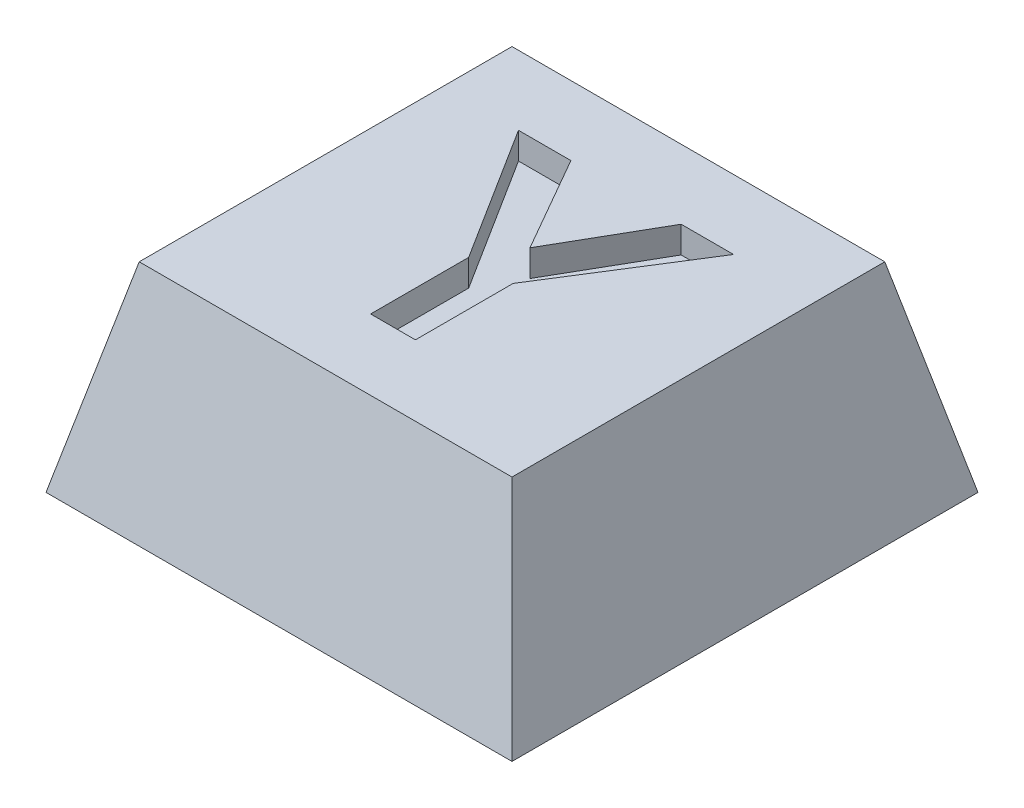
ISO-10303-21;
HEADER;
FILE_DESCRIPTION(('STEP AP214'),'2;1');
FILE_NAME('part.step','',(''),(''),'','','');
FILE_SCHEMA(('AUTOMOTIVE_DESIGN { 1 0 10303 214 1 1 1 1 }'));
ENDSEC;
DATA;
#1=APPLICATION_CONTEXT('core data for automotive mechanical design processes');
#2=APPLICATION_PROTOCOL_DEFINITION('international standard','automotive_design',2000,#1);
#3=PRODUCT_CONTEXT('',#1,'mechanical');
#4=PRODUCT('Part','Part','',(#3));
#5=PRODUCT_RELATED_PRODUCT_CATEGORY('part','',(#4));
#6=PRODUCT_DEFINITION_FORMATION('','',#4);
#7=PRODUCT_DEFINITION_CONTEXT('part definition',#1,'design');
#8=PRODUCT_DEFINITION('design','',#6,#7);
#9=PRODUCT_DEFINITION_SHAPE('','',#8);
#10=(LENGTH_UNIT() NAMED_UNIT(*) SI_UNIT(.MILLI.,.METRE.));
#11=(NAMED_UNIT(*) PLANE_ANGLE_UNIT() SI_UNIT($,.RADIAN.));
#12=(NAMED_UNIT(*) SI_UNIT($,.STERADIAN.) SOLID_ANGLE_UNIT());
#13=UNCERTAINTY_MEASURE_WITH_UNIT(LENGTH_MEASURE(1.E-05),#10,'distance_accuracy_value','');
#14=(GEOMETRIC_REPRESENTATION_CONTEXT(3) GLOBAL_UNCERTAINTY_ASSIGNED_CONTEXT((#13)) GLOBAL_UNIT_ASSIGNED_CONTEXT((#10,
#11,#12)) REPRESENTATION_CONTEXT('',''));
#15=CARTESIAN_POINT('',(0.,0.,0.));
#16=DIRECTION('',(0.,0.,1.));
#17=DIRECTION('',(1.,0.,0.));
#18=AXIS2_PLACEMENT_3D('',#15,#16,#17);
#19=CARTESIAN_POINT('',(0.,3.,0.));
#20=DIRECTION('',(0.,-1.,0.));
#21=DIRECTION('',(0.,0.,-1.));
#22=AXIS2_PLACEMENT_3D('',#19,#20,#21);
#23=PLANE('',#22);
#24=DIRECTION('',(-1.,0.,0.));
#25=VECTOR('',#24,1.);
#26=CARTESIAN_POINT('',(11.,3.,-0.7));
#27=LINE('',#26,#25);
#28=CARTESIAN_POINT('',(6.3,3.,-0.7));
#29=VERTEX_POINT('',#28);
#30=CARTESIAN_POINT('',(0.7,3.,-0.7));
#31=VERTEX_POINT('',#30);
#32=EDGE_CURVE('E66',#29,#31,#27,.T.);
#33=ORIENTED_EDGE('',*,*,#32,.F.);
#34=DIRECTION('',(0.,0.,1.));
#35=VECTOR('',#34,1.);
#36=CARTESIAN_POINT('',(6.3,3.,-7.));
#37=LINE('',#36,#35);
#38=CARTESIAN_POINT('',(6.3,3.,-6.3));
#39=VERTEX_POINT('',#38);
#40=EDGE_CURVE('E189',#39,#29,#37,.T.);
#41=ORIENTED_EDGE('',*,*,#40,.F.);
#42=DIRECTION('',(-1.,0.,0.));
#43=VECTOR('',#42,1.);
#44=CARTESIAN_POINT('',(11.,3.,-6.3));
#45=LINE('',#44,#43);
#46=CARTESIAN_POINT('',(0.699999999999998,3.,-6.3));
#47=VERTEX_POINT('',#46);
#48=EDGE_CURVE('E176',#39,#47,#45,.T.);
#49=ORIENTED_EDGE('',*,*,#48,.T.);
#50=DIRECTION('',(0.,0.,1.));
#51=VECTOR('',#50,1.);
#52=CARTESIAN_POINT('',(0.7,3.,-7.));
#53=LINE('',#52,#51);
#54=EDGE_CURVE('E190',#47,#31,#53,.T.);
#55=ORIENTED_EDGE('',*,*,#54,.T.);
#56=EDGE_LOOP('',(#33,#41,#49,#55));
#57=FACE_BOUND('',#56,.T.);
#58=DIRECTION('',(-1.,0.,0.));
#59=VECTOR('',#58,1.);
#60=CARTESIAN_POINT('',(3.7899740454906,3.,-1.75928235155919));
#61=LINE('',#60,#59);
#62=CARTESIAN_POINT('',(3.7899740454906,3.,-1.75928235155919));
#63=VERTEX_POINT('',#62);
#64=CARTESIAN_POINT('',(3.11689712241367,3.,-1.75928235155919));
#65=VERTEX_POINT('',#64);
#66=EDGE_CURVE('E59',#63,#65,#61,.T.);
#67=ORIENTED_EDGE('',*,*,#66,.T.);
#68=DIRECTION('',(0.,0.,-1.));
#69=VECTOR('',#68,1.);
#70=CARTESIAN_POINT('',(3.11689712241367,3.,-1.75928235155919));
#71=LINE('',#70,#69);
#72=CARTESIAN_POINT('',(3.11689712241367,3.,-3.23233924258483));
#73=VERTEX_POINT('',#72);
#74=EDGE_CURVE('E160',#65,#73,#71,.T.);
#75=ORIENTED_EDGE('',*,*,#74,.T.);
#76=DIRECTION('',(-0.533596697576265,0.,-0.845739063976416));
#77=VECTOR('',#76,1.);
#78=CARTESIAN_POINT('',(3.11689712241367,3.,-3.23233924258483));
#79=LINE('',#78,#77);
#80=CARTESIAN_POINT('',(1.83805096856752,3.,-5.25928235155919));
#81=VERTEX_POINT('',#80);
#82=EDGE_CURVE('E470',#73,#81,#79,.T.);
#83=ORIENTED_EDGE('',*,*,#82,.T.);
#84=DIRECTION('',(1.,0.,0.));
#85=VECTOR('',#84,1.);
#86=CARTESIAN_POINT('',(1.83805096856752,3.,-5.25928235155919));
#87=LINE('',#86,#85);
#88=CARTESIAN_POINT('',(2.62541074420854,3.,-5.25928235155919));
#89=VERTEX_POINT('',#88);
#90=EDGE_CURVE('E472',#81,#89,#87,.T.);
#91=ORIENTED_EDGE('',*,*,#90,.T.);
#92=DIRECTION('',(0.497591443991854,0.,0.867411525670545));
#93=VECTOR('',#92,1.);
#94=CARTESIAN_POINT('',(2.62541074420854,3.,-5.25928235155919));
#95=LINE('',#94,#93);
#96=CARTESIAN_POINT('',(3.45273446215726,3.,-3.81707481950791));
#97=VERTEX_POINT('',#96);
#98=EDGE_CURVE('E477',#89,#97,#95,.T.);
#99=ORIENTED_EDGE('',*,*,#98,.T.);
#100=DIRECTION('',(0.498225602522097,0.,-0.867047431800299));
#101=VECTOR('',#100,1.);
#102=CARTESIAN_POINT('',(3.45273446215726,3.,-3.81707481950791));
#103=LINE('',#102,#101);
#104=CARTESIAN_POINT('',(4.28146042369572,3.,-5.25928235155919));
#105=VERTEX_POINT('',#104);
#106=EDGE_CURVE('E445',#97,#105,#103,.T.);
#107=ORIENTED_EDGE('',*,*,#106,.T.);
#108=DIRECTION('',(1.,0.,0.));
#109=VECTOR('',#108,1.);
#110=CARTESIAN_POINT('',(4.28146042369572,3.,-5.25928235155919));
#111=LINE('',#110,#109);
#112=CARTESIAN_POINT('',(5.06882019933675,3.,-5.25928235155919));
#113=VERTEX_POINT('',#112);
#114=EDGE_CURVE('E440',#105,#113,#111,.T.);
#115=ORIENTED_EDGE('',*,*,#114,.T.);
#116=DIRECTION('',(-0.532673842471013,0.,0.846320611557563));
#117=VECTOR('',#116,1.);
#118=CARTESIAN_POINT('',(5.06882019933675,3.,-5.25928235155919));
#119=LINE('',#118,#117);
#120=CARTESIAN_POINT('',(3.7899740454906,3.,-3.22743139002073));
#121=VERTEX_POINT('',#120);
#122=EDGE_CURVE('E434',#113,#121,#119,.T.);
#123=ORIENTED_EDGE('',*,*,#122,.T.);
#124=DIRECTION('',(0.,0.,1.));
#125=VECTOR('',#124,1.);
#126=CARTESIAN_POINT('',(3.7899740454906,3.,-3.22743139002073));
#127=LINE('',#126,#125);
#128=EDGE_CURVE('E156',#121,#63,#127,.T.);
#129=ORIENTED_EDGE('',*,*,#128,.T.);
#130=EDGE_LOOP('',(#67,#75,#83,#91,#99,#107,#115,#123,#129));
#131=FACE_BOUND('',#130,.T.);
#132=ADVANCED_FACE('F43',(#57,#131),#23,.F.);
#133=CARTESIAN_POINT('',(7.,0.,-7.));
#134=DIRECTION('',(-0.973841209741793,-0.227229615606418,0.));
#135=DIRECTION('',(0.227229615606418,-0.973841209741793,0.));
#136=AXIS2_PLACEMENT_3D('',#133,#134,#135);
#137=PLANE('',#136);
#138=DIRECTION('',(-0.221581128241521,0.949633406749377,-0.221581128241521));
#139=VECTOR('',#138,1.);
#140=CARTESIAN_POINT('',(6.6563126252505,1.47294589178357,-0.343687374749499));
#141=LINE('',#140,#139);
#142=CARTESIAN_POINT('',(7.,0.,0.));
#143=VERTEX_POINT('',#142);
#144=EDGE_CURVE('E186',#143,#29,#141,.T.);
#145=ORIENTED_EDGE('',*,*,#144,.F.);
#146=DIRECTION('',(0.,0.,-1.));
#147=VECTOR('',#146,1.);
#148=CARTESIAN_POINT('',(7.,0.,0.));
#149=LINE('',#148,#147);
#150=CARTESIAN_POINT('',(7.,0.,-7.));
#151=VERTEX_POINT('',#150);
#152=EDGE_CURVE('E204',#143,#151,#149,.T.);
#153=ORIENTED_EDGE('',*,*,#152,.T.);
#154=DIRECTION('',(0.221581128241521,-0.949633406749377,-0.221581128241521));
#155=VECTOR('',#154,1.);
#156=CARTESIAN_POINT('',(7.,0.,-7.));
#157=LINE('',#156,#155);
#158=EDGE_CURVE('E180',#39,#151,#157,.T.);
#159=ORIENTED_EDGE('',*,*,#158,.F.);
#160=ORIENTED_EDGE('',*,*,#40,.T.);
#161=EDGE_LOOP('',(#145,#153,#159,#160));
#162=FACE_BOUND('',#161,.T.);
#163=ADVANCED_FACE('F229',(#162),#137,.F.);
#164=CARTESIAN_POINT('',(0.,0.,-7.));
#165=DIRECTION('',(0.973841209741793,-0.227229615606418,0.));
#166=DIRECTION('',(0.227229615606418,0.973841209741793,0.));
#167=AXIS2_PLACEMENT_3D('',#164,#165,#166);
#168=PLANE('',#167);
#169=DIRECTION('',(-0.221581128241521,-0.949633406749378,0.221581128241521));
#170=VECTOR('',#169,1.);
#171=CARTESIAN_POINT('',(0.343687374749499,1.47294589178357,-0.3436873747495));
#172=LINE('',#171,#170);
#173=CARTESIAN_POINT('',(0.,0.,0.));
#174=VERTEX_POINT('',#173);
#175=EDGE_CURVE('E11',#31,#174,#172,.T.);
#176=ORIENTED_EDGE('',*,*,#175,.F.);
#177=ORIENTED_EDGE('',*,*,#54,.F.);
#178=DIRECTION('',(0.221581128241521,0.949633406749377,0.221581128241521));
#179=VECTOR('',#178,1.);
#180=CARTESIAN_POINT('',(0.,0.,-7.));
#181=LINE('',#180,#179);
#182=CARTESIAN_POINT('',(0.,0.,-7.));
#183=VERTEX_POINT('',#182);
#184=EDGE_CURVE('E52',#183,#47,#181,.T.);
#185=ORIENTED_EDGE('',*,*,#184,.F.);
#186=DIRECTION('',(0.,0.,1.));
#187=VECTOR('',#186,1.);
#188=CARTESIAN_POINT('',(0.,0.,0.));
#189=LINE('',#188,#187);
#190=EDGE_CURVE('E194',#183,#174,#189,.T.);
#191=ORIENTED_EDGE('',*,*,#190,.T.);
#192=EDGE_LOOP('',(#176,#177,#185,#191));
#193=FACE_BOUND('',#192,.T.);
#194=ADVANCED_FACE('F222',(#193),#168,.F.);
#195=CARTESIAN_POINT('',(0.,0.,0.));
#196=DIRECTION('',(0.,-1.,0.));
#197=DIRECTION('',(0.,0.,-1.));
#198=AXIS2_PLACEMENT_3D('',#195,#196,#197);
#199=PLANE('',#198);
#200=CARTESIAN_POINT('',(3.5,0.,-3.5));
#201=DIRECTION('',(0.,-1.,0.));
#202=DIRECTION('',(0.,0.,-1.));
#203=AXIS2_PLACEMENT_3D('',#200,#201,#202);
#204=CIRCLE('',#203,1.8);
#205=CARTESIAN_POINT('',(3.5,0.,-5.3));
#206=VERTEX_POINT('',#205);
#207=EDGE_CURVE('E162',#206,#206,#204,.T.);
#208=ORIENTED_EDGE('',*,*,#207,.F.);
#209=EDGE_LOOP('',(#208));
#210=FACE_BOUND('',#209,.T.);
#211=ORIENTED_EDGE('',*,*,#190,.F.);
#212=DIRECTION('',(-1.,0.,0.));
#213=VECTOR('',#212,1.);
#214=CARTESIAN_POINT('',(0.,0.,-7.));
#215=LINE('',#214,#213);
#216=EDGE_CURVE('E208',#151,#183,#215,.T.);
#217=ORIENTED_EDGE('',*,*,#216,.F.);
#218=ORIENTED_EDGE('',*,*,#152,.F.);
#219=DIRECTION('',(1.,0.,0.));
#220=VECTOR('',#219,1.);
#221=CARTESIAN_POINT('',(0.,0.,0.));
#222=LINE('',#221,#220);
#223=EDGE_CURVE('E201',#174,#143,#222,.T.);
#224=ORIENTED_EDGE('',*,*,#223,.F.);
#225=EDGE_LOOP('',(#211,#217,#218,#224));
#226=FACE_BOUND('',#225,.T.);
#227=ADVANCED_FACE('F45',(#210,#226),#199,.T.);
#228=CARTESIAN_POINT('',(11.,3.,-6.3));
#229=DIRECTION('',(0.,0.227229615606418,-0.973841209741793));
#230=DIRECTION('',(0.,0.973841209741793,0.227229615606418));
#231=AXIS2_PLACEMENT_3D('',#228,#229,#230);
#232=PLANE('',#231);
#233=ORIENTED_EDGE('',*,*,#158,.T.);
#234=ORIENTED_EDGE('',*,*,#216,.T.);
#235=ORIENTED_EDGE('',*,*,#184,.T.);
#236=ORIENTED_EDGE('',*,*,#48,.F.);
#237=EDGE_LOOP('',(#233,#234,#235,#236));
#238=FACE_BOUND('',#237,.T.);
#239=ADVANCED_FACE('F213',(#238),#232,.T.);
#240=CARTESIAN_POINT('',(11.,0.,0.));
#241=DIRECTION('',(0.,0.227229615606418,0.973841209741793));
#242=DIRECTION('',(0.,-0.973841209741793,0.227229615606418));
#243=AXIS2_PLACEMENT_3D('',#240,#241,#242);
#244=PLANE('',#243);
#245=ORIENTED_EDGE('',*,*,#144,.T.);
#246=ORIENTED_EDGE('',*,*,#32,.T.);
#247=ORIENTED_EDGE('',*,*,#175,.T.);
#248=ORIENTED_EDGE('',*,*,#223,.T.);
#249=EDGE_LOOP('',(#245,#246,#247,#248));
#250=FACE_BOUND('',#249,.T.);
#251=ADVANCED_FACE('F224',(#250),#244,.T.);
#252=CARTESIAN_POINT('',(3.5,0.8,-3.5));
#253=DIRECTION('',(0.,-1.,0.));
#254=DIRECTION('',(0.,0.,-1.));
#255=AXIS2_PLACEMENT_3D('',#252,#253,#254);
#256=CYLINDRICAL_SURFACE('',#255,1.8);
#257=CARTESIAN_POINT('',(3.5,0.8,-3.5));
#258=DIRECTION('',(0.,-1.,0.));
#259=DIRECTION('',(0.,0.,-1.));
#260=AXIS2_PLACEMENT_3D('',#257,#258,#259);
#261=CIRCLE('',#260,1.8);
#262=CARTESIAN_POINT('',(3.5,0.8,-5.3));
#263=VERTEX_POINT('',#262);
#264=EDGE_CURVE('E168',#263,#263,#261,.T.);
#265=ORIENTED_EDGE('',*,*,#264,.F.);
#266=EDGE_LOOP('',(#265));
#267=FACE_BOUND('',#266,.T.);
#268=ORIENTED_EDGE('',*,*,#207,.T.);
#269=EDGE_LOOP('',(#268));
#270=FACE_BOUND('',#269,.T.);
#271=ADVANCED_FACE('F247',(#267,#270),#256,.F.);
#272=CARTESIAN_POINT('',(3.5,0.8,-3.5));
#273=DIRECTION('',(0.,-1.,0.));
#274=DIRECTION('',(0.,0.,-1.));
#275=AXIS2_PLACEMENT_3D('',#272,#273,#274);
#276=PLANE('',#275);
#277=ORIENTED_EDGE('',*,*,#264,.T.);
#278=EDGE_LOOP('',(#277));
#279=FACE_BOUND('',#278,.T.);
#280=ADVANCED_FACE('F250',(#279),#276,.T.);
#281=CARTESIAN_POINT('',(3.7899740454906,2.6,-1.75928235155919));
#282=DIRECTION('',(0.,0.,-1.));
#283=DIRECTION('',(-1.,0.,0.));
#284=AXIS2_PLACEMENT_3D('',#281,#282,#283);
#285=PLANE('',#284);
#286=ORIENTED_EDGE('',*,*,#66,.F.);
#287=DIRECTION('',(0.,1.,0.));
#288=VECTOR('',#287,1.);
#289=CARTESIAN_POINT('',(3.7899740454906,2.6,-1.75928235155919));
#290=LINE('',#289,#288);
#291=CARTESIAN_POINT('',(3.7899740454906,2.6,-1.75928235155919));
#292=VERTEX_POINT('',#291);
#293=EDGE_CURVE('E154',#292,#63,#290,.T.);
#294=ORIENTED_EDGE('',*,*,#293,.F.);
#295=DIRECTION('',(-1.,0.,0.));
#296=VECTOR('',#295,1.);
#297=CARTESIAN_POINT('',(3.7899740454906,2.6,-1.75928235155919));
#298=LINE('',#297,#296);
#299=CARTESIAN_POINT('',(3.11689712241367,2.6,-1.75928235155919));
#300=VERTEX_POINT('',#299);
#301=EDGE_CURVE('E144',#292,#300,#298,.T.);
#302=ORIENTED_EDGE('',*,*,#301,.T.);
#303=DIRECTION('',(0.,1.,0.));
#304=VECTOR('',#303,1.);
#305=CARTESIAN_POINT('',(3.11689712241367,2.6,-1.75928235155919));
#306=LINE('',#305,#304);
#307=EDGE_CURVE('E153',#300,#65,#306,.T.);
#308=ORIENTED_EDGE('',*,*,#307,.T.);
#309=EDGE_LOOP('',(#286,#294,#302,#308));
#310=FACE_BOUND('',#309,.T.);
#311=ADVANCED_FACE('F152',(#310),#285,.T.);
#312=CARTESIAN_POINT('',(3.11689712241367,2.6,-1.75928235155919));
#313=DIRECTION('',(1.,0.,0.));
#314=DIRECTION('',(0.,0.,-1.));
#315=AXIS2_PLACEMENT_3D('',#312,#313,#314);
#316=PLANE('',#315);
#317=ORIENTED_EDGE('',*,*,#74,.F.);
#318=ORIENTED_EDGE('',*,*,#307,.F.);
#319=DIRECTION('',(0.,0.,-1.));
#320=VECTOR('',#319,1.);
#321=CARTESIAN_POINT('',(3.11689712241367,2.6,-1.75928235155919));
#322=LINE('',#321,#320);
#323=CARTESIAN_POINT('',(3.11689712241367,2.6,-3.23233924258483));
#324=VERTEX_POINT('',#323);
#325=EDGE_CURVE('E140',#300,#324,#322,.T.);
#326=ORIENTED_EDGE('',*,*,#325,.T.);
#327=DIRECTION('',(0.,1.,0.));
#328=VECTOR('',#327,1.);
#329=CARTESIAN_POINT('',(3.11689712241367,2.6,-3.23233924258483));
#330=LINE('',#329,#328);
#331=EDGE_CURVE('E163',#324,#73,#330,.T.);
#332=ORIENTED_EDGE('',*,*,#331,.T.);
#333=EDGE_LOOP('',(#317,#318,#326,#332));
#334=FACE_BOUND('',#333,.T.);
#335=ADVANCED_FACE('F158',(#334),#316,.T.);
#336=CARTESIAN_POINT('',(3.11689712241367,2.6,-3.23233924258483));
#337=DIRECTION('',(0.845739063976416,0.,-0.533596697576265));
#338=DIRECTION('',(-0.533596697576265,0.,-0.845739063976416));
#339=AXIS2_PLACEMENT_3D('',#336,#337,#338);
#340=PLANE('',#339);
#341=ORIENTED_EDGE('',*,*,#82,.F.);
#342=ORIENTED_EDGE('',*,*,#331,.F.);
#343=DIRECTION('',(-0.533596697576265,0.,-0.845739063976416));
#344=VECTOR('',#343,1.);
#345=CARTESIAN_POINT('',(3.11689712241367,2.6,-3.23233924258483));
#346=LINE('',#345,#344);
#347=CARTESIAN_POINT('',(1.83805096856752,2.6,-5.25928235155919));
#348=VERTEX_POINT('',#347);
#349=EDGE_CURVE('E146',#324,#348,#346,.T.);
#350=ORIENTED_EDGE('',*,*,#349,.T.);
#351=DIRECTION('',(0.,1.,0.));
#352=VECTOR('',#351,1.);
#353=CARTESIAN_POINT('',(1.83805096856752,2.6,-5.25928235155919));
#354=LINE('',#353,#352);
#355=EDGE_CURVE('E170',#348,#81,#354,.T.);
#356=ORIENTED_EDGE('',*,*,#355,.T.);
#357=EDGE_LOOP('',(#341,#342,#350,#356));
#358=FACE_BOUND('',#357,.T.);
#359=ADVANCED_FACE('F259',(#358),#340,.T.);
#360=CARTESIAN_POINT('',(1.83805096856752,2.6,-5.25928235155919));
#361=DIRECTION('',(0.,0.,1.));
#362=DIRECTION('',(1.,0.,0.));
#363=AXIS2_PLACEMENT_3D('',#360,#361,#362);
#364=PLANE('',#363);
#365=ORIENTED_EDGE('',*,*,#90,.F.);
#366=ORIENTED_EDGE('',*,*,#355,.F.);
#367=DIRECTION('',(1.,0.,0.));
#368=VECTOR('',#367,1.);
#369=CARTESIAN_POINT('',(1.83805096856752,2.6,-5.25928235155919));
#370=LINE('',#369,#368);
#371=CARTESIAN_POINT('',(2.62541074420854,2.6,-5.25928235155919));
#372=VERTEX_POINT('',#371);
#373=EDGE_CURVE('E509',#348,#372,#370,.T.);
#374=ORIENTED_EDGE('',*,*,#373,.T.);
#375=DIRECTION('',(0.,1.,0.));
#376=VECTOR('',#375,1.);
#377=CARTESIAN_POINT('',(2.62541074420854,2.6,-5.25928235155919));
#378=LINE('',#377,#376);
#379=EDGE_CURVE('E463',#372,#89,#378,.T.);
#380=ORIENTED_EDGE('',*,*,#379,.T.);
#381=EDGE_LOOP('',(#365,#366,#374,#380));
#382=FACE_BOUND('',#381,.T.);
#383=ADVANCED_FACE('F262',(#382),#364,.T.);
#384=CARTESIAN_POINT('',(2.62541074420854,2.6,-5.25928235155919));
#385=DIRECTION('',(-0.867411525670545,0.,0.497591443991854));
#386=DIRECTION('',(0.497591443991854,0.,0.867411525670545));
#387=AXIS2_PLACEMENT_3D('',#384,#385,#386);
#388=PLANE('',#387);
#389=ORIENTED_EDGE('',*,*,#98,.F.);
#390=ORIENTED_EDGE('',*,*,#379,.F.);
#391=DIRECTION('',(0.497591443991854,0.,0.867411525670545));
#392=VECTOR('',#391,1.);
#393=CARTESIAN_POINT('',(2.62541074420854,2.6,-5.25928235155919));
#394=LINE('',#393,#392);
#395=CARTESIAN_POINT('',(3.45273446215726,2.6,-3.81707481950791));
#396=VERTEX_POINT('',#395);
#397=EDGE_CURVE('E506',#372,#396,#394,.T.);
#398=ORIENTED_EDGE('',*,*,#397,.T.);
#399=DIRECTION('',(0.,1.,0.));
#400=VECTOR('',#399,1.);
#401=CARTESIAN_POINT('',(3.45273446215726,2.6,-3.81707481950791));
#402=LINE('',#401,#400);
#403=EDGE_CURVE('E460',#396,#97,#402,.T.);
#404=ORIENTED_EDGE('',*,*,#403,.T.);
#405=EDGE_LOOP('',(#389,#390,#398,#404));
#406=FACE_BOUND('',#405,.T.);
#407=ADVANCED_FACE('F266',(#406),#388,.T.);
#408=CARTESIAN_POINT('',(3.45273446215726,2.6,-3.81707481950791));
#409=DIRECTION('',(0.867047431800299,0.,0.498225602522097));
#410=DIRECTION('',(0.498225602522097,0.,-0.867047431800299));
#411=AXIS2_PLACEMENT_3D('',#408,#409,#410);
#412=PLANE('',#411);
#413=ORIENTED_EDGE('',*,*,#106,.F.);
#414=ORIENTED_EDGE('',*,*,#403,.F.);
#415=DIRECTION('',(0.498225602522097,0.,-0.867047431800299));
#416=VECTOR('',#415,1.);
#417=CARTESIAN_POINT('',(3.45273446215726,2.6,-3.81707481950791));
#418=LINE('',#417,#416);
#419=CARTESIAN_POINT('',(4.28146042369572,2.6,-5.25928235155919));
#420=VERTEX_POINT('',#419);
#421=EDGE_CURVE('E491',#396,#420,#418,.T.);
#422=ORIENTED_EDGE('',*,*,#421,.T.);
#423=DIRECTION('',(0.,1.,0.));
#424=VECTOR('',#423,1.);
#425=CARTESIAN_POINT('',(4.28146042369572,2.6,-5.25928235155919));
#426=LINE('',#425,#424);
#427=EDGE_CURVE('E457',#420,#105,#426,.T.);
#428=ORIENTED_EDGE('',*,*,#427,.T.);
#429=EDGE_LOOP('',(#413,#414,#422,#428));
#430=FACE_BOUND('',#429,.T.);
#431=ADVANCED_FACE('F270',(#430),#412,.T.);
#432=CARTESIAN_POINT('',(4.28146042369572,2.6,-5.25928235155919));
#433=DIRECTION('',(0.,0.,1.));
#434=DIRECTION('',(1.,0.,0.));
#435=AXIS2_PLACEMENT_3D('',#432,#433,#434);
#436=PLANE('',#435);
#437=ORIENTED_EDGE('',*,*,#114,.F.);
#438=ORIENTED_EDGE('',*,*,#427,.F.);
#439=DIRECTION('',(1.,0.,0.));
#440=VECTOR('',#439,1.);
#441=CARTESIAN_POINT('',(4.28146042369572,2.6,-5.25928235155919));
#442=LINE('',#441,#440);
#443=CARTESIAN_POINT('',(5.06882019933675,2.6,-5.25928235155919));
#444=VERTEX_POINT('',#443);
#445=EDGE_CURVE('E493',#420,#444,#442,.T.);
#446=ORIENTED_EDGE('',*,*,#445,.T.);
#447=DIRECTION('',(0.,1.,0.));
#448=VECTOR('',#447,1.);
#449=CARTESIAN_POINT('',(5.06882019933675,2.6,-5.25928235155919));
#450=LINE('',#449,#448);
#451=EDGE_CURVE('E454',#444,#113,#450,.T.);
#452=ORIENTED_EDGE('',*,*,#451,.T.);
#453=EDGE_LOOP('',(#437,#438,#446,#452));
#454=FACE_BOUND('',#453,.T.);
#455=ADVANCED_FACE('F274',(#454),#436,.T.);
#456=CARTESIAN_POINT('',(5.06882019933675,2.6,-5.25928235155919));
#457=DIRECTION('',(-0.846320611557563,0.,-0.532673842471013));
#458=DIRECTION('',(-0.532673842471013,0.,0.846320611557563));
#459=AXIS2_PLACEMENT_3D('',#456,#457,#458);
#460=PLANE('',#459);
#461=ORIENTED_EDGE('',*,*,#122,.F.);
#462=ORIENTED_EDGE('',*,*,#451,.F.);
#463=DIRECTION('',(-0.532673842471013,0.,0.846320611557563));
#464=VECTOR('',#463,1.);
#465=CARTESIAN_POINT('',(5.06882019933675,2.6,-5.25928235155919));
#466=LINE('',#465,#464);
#467=CARTESIAN_POINT('',(3.7899740454906,2.6,-3.22743139002073));
#468=VERTEX_POINT('',#467);
#469=EDGE_CURVE('E495',#444,#468,#466,.T.);
#470=ORIENTED_EDGE('',*,*,#469,.T.);
#471=DIRECTION('',(0.,1.,0.));
#472=VECTOR('',#471,1.);
#473=CARTESIAN_POINT('',(3.7899740454906,2.6,-3.22743139002073));
#474=LINE('',#473,#472);
#475=EDGE_CURVE('E432',#468,#121,#474,.T.);
#476=ORIENTED_EDGE('',*,*,#475,.T.);
#477=EDGE_LOOP('',(#461,#462,#470,#476));
#478=FACE_BOUND('',#477,.T.);
#479=ADVANCED_FACE('F278',(#478),#460,.T.);
#480=CARTESIAN_POINT('',(3.7899740454906,2.6,-3.22743139002073));
#481=DIRECTION('',(-1.,0.,0.));
#482=DIRECTION('',(0.,0.,1.));
#483=AXIS2_PLACEMENT_3D('',#480,#481,#482);
#484=PLANE('',#483);
#485=ORIENTED_EDGE('',*,*,#128,.F.);
#486=ORIENTED_EDGE('',*,*,#475,.F.);
#487=DIRECTION('',(0.,0.,1.));
#488=VECTOR('',#487,1.);
#489=CARTESIAN_POINT('',(3.7899740454906,2.6,-3.22743139002073));
#490=LINE('',#489,#488);
#491=EDGE_CURVE('E451',#468,#292,#490,.T.);
#492=ORIENTED_EDGE('',*,*,#491,.T.);
#493=ORIENTED_EDGE('',*,*,#293,.T.);
#494=EDGE_LOOP('',(#485,#486,#492,#493));
#495=FACE_BOUND('',#494,.T.);
#496=ADVANCED_FACE('F282',(#495),#484,.T.);
#497=CARTESIAN_POINT('',(0.,2.6,0.));
#498=DIRECTION('',(0.,-1.,0.));
#499=DIRECTION('',(0.,0.,-1.));
#500=AXIS2_PLACEMENT_3D('',#497,#498,#499);
#501=PLANE('',#500);
#502=ORIENTED_EDGE('',*,*,#301,.F.);
#503=ORIENTED_EDGE('',*,*,#491,.F.);
#504=ORIENTED_EDGE('',*,*,#469,.F.);
#505=ORIENTED_EDGE('',*,*,#445,.F.);
#506=ORIENTED_EDGE('',*,*,#421,.F.);
#507=ORIENTED_EDGE('',*,*,#397,.F.);
#508=ORIENTED_EDGE('',*,*,#373,.F.);
#509=ORIENTED_EDGE('',*,*,#349,.F.);
#510=ORIENTED_EDGE('',*,*,#325,.F.);
#511=EDGE_LOOP('',(#502,#503,#504,#505,#506,#507,#508,#509,#510));
#512=FACE_BOUND('',#511,.T.);
#513=ADVANCED_FACE('F142',(#512),#501,.F.);
#514=CLOSED_SHELL('',(#132,#163,#194,#227,#239,#251,#271,#280,#311,#335,#359,#383,#407,#431,
#455,#479,#496,#513));
#515=MANIFOLD_SOLID_BREP('B2',#514);
#516=ADVANCED_BREP_SHAPE_REPRESENTATION('',(#18,#515),#14);
#517=SHAPE_DEFINITION_REPRESENTATION(#9,#516);
ENDSEC;
END-ISO-10303-21;
